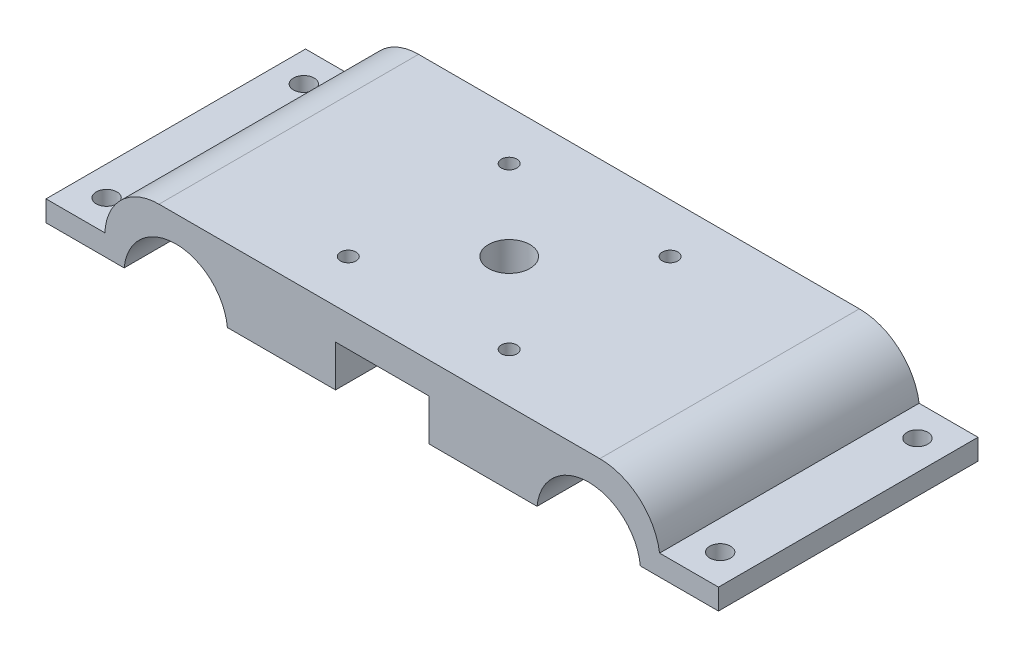
ISO-10303-21;
HEADER;
FILE_DESCRIPTION(('STEP AP214'),'2;1');
FILE_NAME('part.step','',(''),(''),'','','');
FILE_SCHEMA(('AUTOMOTIVE_DESIGN { 1 0 10303 214 1 1 1 1 }'));
ENDSEC;
DATA;
#1=APPLICATION_CONTEXT('core data for automotive mechanical design processes');
#2=APPLICATION_PROTOCOL_DEFINITION('international standard','automotive_design',2000,#1);
#3=PRODUCT_CONTEXT('',#1,'mechanical');
#4=PRODUCT('Part','Part','',(#3));
#5=PRODUCT_RELATED_PRODUCT_CATEGORY('part','',(#4));
#6=PRODUCT_DEFINITION_FORMATION('','',#4);
#7=PRODUCT_DEFINITION_CONTEXT('part definition',#1,'design');
#8=PRODUCT_DEFINITION('design','',#6,#7);
#9=PRODUCT_DEFINITION_SHAPE('','',#8);
#10=(LENGTH_UNIT() NAMED_UNIT(*) SI_UNIT(.MILLI.,.METRE.));
#11=(NAMED_UNIT(*) PLANE_ANGLE_UNIT() SI_UNIT($,.RADIAN.));
#12=(NAMED_UNIT(*) SI_UNIT($,.STERADIAN.) SOLID_ANGLE_UNIT());
#13=UNCERTAINTY_MEASURE_WITH_UNIT(LENGTH_MEASURE(1.E-05),#10,'distance_accuracy_value','');
#14=(GEOMETRIC_REPRESENTATION_CONTEXT(3) GLOBAL_UNCERTAINTY_ASSIGNED_CONTEXT((#13)) GLOBAL_UNIT_ASSIGNED_CONTEXT((#10,
#11,#12)) REPRESENTATION_CONTEXT('',''));
#15=CARTESIAN_POINT('',(0.,0.,0.));
#16=DIRECTION('',(0.,0.,1.));
#17=DIRECTION('',(1.,0.,0.));
#18=AXIS2_PLACEMENT_3D('',#15,#16,#17);
#19=CARTESIAN_POINT('',(-51.3618600632337,6.47404671071969,50.));
#20=DIRECTION('',(0.,0.,-1.));
#21=DIRECTION('',(-1.,0.,0.));
#22=AXIS2_PLACEMENT_3D('',#19,#20,#21);
#23=CYLINDRICAL_SURFACE('',#22,10.);
#24=CARTESIAN_POINT('',(-51.3618600632337,6.47404671071969,0.));
#25=DIRECTION('',(0.,0.,-1.));
#26=DIRECTION('',(-1.,0.,0.));
#27=AXIS2_PLACEMENT_3D('',#24,#25,#26);
#28=CIRCLE('',#27,10.);
#29=CARTESIAN_POINT('',(-61.3117344342999,7.47404671071969,0.));
#30=VERTEX_POINT('',#29);
#31=CARTESIAN_POINT('',(-41.4119856921675,7.47404671071969,0.));
#32=VERTEX_POINT('',#31);
#33=EDGE_CURVE('E171',#30,#32,#28,.T.);
#34=ORIENTED_EDGE('',*,*,#33,.T.);
#35=DIRECTION('',(0.,0.,-1.));
#36=VECTOR('',#35,1.);
#37=CARTESIAN_POINT('',(-41.4119856921675,7.47404671071969,50.));
#38=LINE('',#37,#36);
#39=CARTESIAN_POINT('',(-41.4119856921675,7.47404671071969,50.));
#40=VERTEX_POINT('',#39);
#41=EDGE_CURVE('E271',#32,#40,#38,.F.);
#42=ORIENTED_EDGE('',*,*,#41,.T.);
#43=CARTESIAN_POINT('',(-51.3618600632337,6.47404671071969,50.));
#44=DIRECTION('',(0.,0.,-1.));
#45=DIRECTION('',(-1.,0.,0.));
#46=AXIS2_PLACEMENT_3D('',#43,#44,#45);
#47=CIRCLE('',#46,10.);
#48=CARTESIAN_POINT('',(-61.3117344342999,7.47404671071969,50.));
#49=VERTEX_POINT('',#48);
#50=EDGE_CURVE('E185',#49,#40,#47,.T.);
#51=ORIENTED_EDGE('',*,*,#50,.F.);
#52=DIRECTION('',(0.,0.,-1.));
#53=VECTOR('',#52,1.);
#54=CARTESIAN_POINT('',(-61.3117344342999,7.47404671071969,50.));
#55=LINE('',#54,#53);
#56=EDGE_CURVE('E272',#49,#30,#55,.T.);
#57=ORIENTED_EDGE('',*,*,#56,.T.);
#58=EDGE_LOOP('',(#34,#42,#51,#57));
#59=FACE_BOUND('',#58,.T.);
#60=ADVANCED_FACE('F33',(#59),#23,.F.);
#61=CARTESIAN_POINT('',(28.1881399367662,6.47404671071969,50.));
#62=DIRECTION('',(0.,0.,-1.));
#63=DIRECTION('',(-1.,0.,0.));
#64=AXIS2_PLACEMENT_3D('',#61,#62,#63);
#65=CYLINDRICAL_SURFACE('',#64,10.);
#66=CARTESIAN_POINT('',(28.1881399367662,6.47404671071969,0.));
#67=DIRECTION('',(0.,0.,-1.));
#68=DIRECTION('',(-1.,0.,0.));
#69=AXIS2_PLACEMENT_3D('',#66,#67,#68);
#70=CIRCLE('',#69,10.);
#71=CARTESIAN_POINT('',(18.2382655657,7.47404671071969,0.));
#72=VERTEX_POINT('',#71);
#73=CARTESIAN_POINT('',(38.1380143078324,7.47404671071969,0.));
#74=VERTEX_POINT('',#73);
#75=EDGE_CURVE('E167',#72,#74,#70,.T.);
#76=ORIENTED_EDGE('',*,*,#75,.T.);
#77=DIRECTION('',(0.,0.,-1.));
#78=VECTOR('',#77,1.);
#79=CARTESIAN_POINT('',(38.1380143078324,7.47404671071969,50.));
#80=LINE('',#79,#78);
#81=CARTESIAN_POINT('',(38.1380143078324,7.47404671071969,50.));
#82=VERTEX_POINT('',#81);
#83=EDGE_CURVE('E49',#74,#82,#80,.F.);
#84=ORIENTED_EDGE('',*,*,#83,.T.);
#85=CARTESIAN_POINT('',(28.1881399367662,6.47404671071969,50.));
#86=DIRECTION('',(0.,0.,-1.));
#87=DIRECTION('',(-1.,0.,0.));
#88=AXIS2_PLACEMENT_3D('',#85,#86,#87);
#89=CIRCLE('',#88,10.);
#90=CARTESIAN_POINT('',(18.2382655657,7.47404671071969,50.));
#91=VERTEX_POINT('',#90);
#92=EDGE_CURVE('E250',#91,#82,#89,.T.);
#93=ORIENTED_EDGE('',*,*,#92,.F.);
#94=DIRECTION('',(0.,0.,-1.));
#95=VECTOR('',#94,1.);
#96=CARTESIAN_POINT('',(18.2382655657,7.47404671071969,50.));
#97=LINE('',#96,#95);
#98=EDGE_CURVE('E313',#91,#72,#97,.T.);
#99=ORIENTED_EDGE('',*,*,#98,.T.);
#100=EDGE_LOOP('',(#76,#84,#93,#99));
#101=FACE_BOUND('',#100,.T.);
#102=ADVANCED_FACE('F372',(#101),#65,.F.);
#103=CARTESIAN_POINT('',(53.1881399367662,6.47404671071969,50.));
#104=DIRECTION('',(-1.,0.,0.));
#105=DIRECTION('',(0.,-1.,0.));
#106=AXIS2_PLACEMENT_3D('',#103,#104,#105);
#107=PLANE('',#106);
#108=DIRECTION('',(0.,1.,0.));
#109=VECTOR('',#108,1.);
#110=CARTESIAN_POINT('',(53.1881399367662,6.47404671071969,50.));
#111=LINE('',#110,#109);
#112=CARTESIAN_POINT('',(53.1881399367662,7.47404671071969,50.));
#113=VERTEX_POINT('',#112);
#114=CARTESIAN_POINT('',(53.1881399367662,11.4740467107197,50.));
#115=VERTEX_POINT('',#114);
#116=EDGE_CURVE('E161',#113,#115,#111,.T.);
#117=ORIENTED_EDGE('',*,*,#116,.F.);
#118=DIRECTION('',(0.,0.,1.));
#119=VECTOR('',#118,1.);
#120=CARTESIAN_POINT('',(53.1881399367662,7.47404671071969,0.));
#121=LINE('',#120,#119);
#122=CARTESIAN_POINT('',(53.1881399367662,7.47404671071969,0.));
#123=VERTEX_POINT('',#122);
#124=EDGE_CURVE('E147',#123,#113,#121,.T.);
#125=ORIENTED_EDGE('',*,*,#124,.F.);
#126=DIRECTION('',(0.,1.,0.));
#127=VECTOR('',#126,1.);
#128=CARTESIAN_POINT('',(53.1881399367662,6.47404671071969,0.));
#129=LINE('',#128,#127);
#130=CARTESIAN_POINT('',(53.1881399367662,11.4740467107197,0.));
#131=VERTEX_POINT('',#130);
#132=EDGE_CURVE('E160',#123,#131,#129,.T.);
#133=ORIENTED_EDGE('',*,*,#132,.T.);
#134=DIRECTION('',(0.,0.,-1.));
#135=VECTOR('',#134,1.);
#136=CARTESIAN_POINT('',(53.1881399367662,11.4740467107197,50.));
#137=LINE('',#136,#135);
#138=EDGE_CURVE('E11',#115,#131,#137,.T.);
#139=ORIENTED_EDGE('',*,*,#138,.F.);
#140=EDGE_LOOP('',(#117,#125,#133,#139));
#141=FACE_BOUND('',#140,.T.);
#142=ADVANCED_FACE('F158',(#141),#107,.F.);
#143=CARTESIAN_POINT('',(53.1881399367662,11.4740467107197,50.));
#144=DIRECTION('',(0.,-1.,0.));
#145=DIRECTION('',(1.,0.,0.));
#146=AXIS2_PLACEMENT_3D('',#143,#144,#145);
#147=PLANE('',#146);
#148=CARTESIAN_POINT('',(47.5181399367662,11.4740467107197,44.));
#149=DIRECTION('',(0.,1.,0.));
#150=DIRECTION('',(-1.,0.,0.));
#151=AXIS2_PLACEMENT_3D('',#148,#149,#150);
#152=CIRCLE('',#151,2.);
#153=CARTESIAN_POINT('',(45.5181399367662,11.4740467107197,44.));
#154=VERTEX_POINT('',#153);
#155=EDGE_CURVE('E234',#154,#154,#152,.T.);
#156=ORIENTED_EDGE('',*,*,#155,.F.);
#157=EDGE_LOOP('',(#156));
#158=FACE_BOUND('',#157,.T.);
#159=CARTESIAN_POINT('',(47.5181399367662,11.4740467107197,6.));
#160=DIRECTION('',(0.,1.,0.));
#161=DIRECTION('',(-1.,0.,0.));
#162=AXIS2_PLACEMENT_3D('',#159,#160,#161);
#163=CIRCLE('',#162,2.);
#164=CARTESIAN_POINT('',(45.5181399367662,11.4740467107197,6.));
#165=VERTEX_POINT('',#164);
#166=EDGE_CURVE('E239',#165,#165,#163,.T.);
#167=ORIENTED_EDGE('',*,*,#166,.F.);
#168=EDGE_LOOP('',(#167));
#169=FACE_BOUND('',#168,.T.);
#170=DIRECTION('',(-1.,0.,0.));
#171=VECTOR('',#170,1.);
#172=CARTESIAN_POINT('',(53.1881399367662,11.4740467107197,0.));
#173=LINE('',#172,#171);
#174=CARTESIAN_POINT('',(41.8483939746106,11.4740467107197,0.));
#175=VERTEX_POINT('',#174);
#176=EDGE_CURVE('E166',#131,#175,#173,.T.);
#177=ORIENTED_EDGE('',*,*,#176,.T.);
#178=DIRECTION('',(0.,0.,-1.));
#179=VECTOR('',#178,1.);
#180=CARTESIAN_POINT('',(41.8483939746106,11.4740467107197,50.));
#181=LINE('',#180,#179);
#182=CARTESIAN_POINT('',(41.8483939746106,11.4740467107197,50.));
#183=VERTEX_POINT('',#182);
#184=EDGE_CURVE('E41',#183,#175,#181,.T.);
#185=ORIENTED_EDGE('',*,*,#184,.F.);
#186=DIRECTION('',(-1.,0.,0.));
#187=VECTOR('',#186,1.);
#188=CARTESIAN_POINT('',(53.1881399367662,11.4740467107197,50.));
#189=LINE('',#188,#187);
#190=EDGE_CURVE('E254',#115,#183,#189,.T.);
#191=ORIENTED_EDGE('',*,*,#190,.F.);
#192=ORIENTED_EDGE('',*,*,#138,.T.);
#193=EDGE_LOOP('',(#177,#185,#191,#192));
#194=FACE_BOUND('',#193,.T.);
#195=ADVANCED_FACE('F362',(#158,#169,#194),#147,.F.);
#196=CARTESIAN_POINT('',(30.3300740869905,9.84046205904238,50.));
#197=DIRECTION('',(0.,0.,-1.));
#198=DIRECTION('',(-1.,0.,0.));
#199=AXIS2_PLACEMENT_3D('',#196,#197,#198);
#200=CYLINDRICAL_SURFACE('',#199,11.6335846516773);
#201=CARTESIAN_POINT('',(30.3300740869905,9.84046205904238,0.));
#202=DIRECTION('',(0.,0.,1.));
#203=DIRECTION('',(1.,0.,0.));
#204=AXIS2_PLACEMENT_3D('',#201,#202,#203);
#205=CIRCLE('',#204,11.6335846516773);
#206=CARTESIAN_POINT('',(30.3300740869905,21.4740467107197,0.));
#207=VERTEX_POINT('',#206);
#208=EDGE_CURVE('E169',#175,#207,#205,.T.);
#209=ORIENTED_EDGE('',*,*,#208,.T.);
#210=DIRECTION('',(0.,0.,-1.));
#211=VECTOR('',#210,1.);
#212=CARTESIAN_POINT('',(30.3300740869905,21.4740467107197,50.));
#213=LINE('',#212,#211);
#214=CARTESIAN_POINT('',(30.3300740869905,21.4740467107197,50.));
#215=VERTEX_POINT('',#214);
#216=EDGE_CURVE('E196',#215,#207,#213,.T.);
#217=ORIENTED_EDGE('',*,*,#216,.F.);
#218=CARTESIAN_POINT('',(30.3300740869905,9.84046205904238,50.));
#219=DIRECTION('',(0.,0.,1.));
#220=DIRECTION('',(1.,0.,0.));
#221=AXIS2_PLACEMENT_3D('',#218,#219,#220);
#222=CIRCLE('',#221,11.6335846516773);
#223=EDGE_CURVE('E256',#183,#215,#222,.T.);
#224=ORIENTED_EDGE('',*,*,#223,.F.);
#225=ORIENTED_EDGE('',*,*,#184,.T.);
#226=EDGE_LOOP('',(#209,#217,#224,#225));
#227=FACE_BOUND('',#226,.T.);
#228=ADVANCED_FACE('F332',(#227),#200,.T.);
#229=CARTESIAN_POINT('',(-54.5909663303495,21.4740467107197,50.));
#230=DIRECTION('',(0.,-1.,0.));
#231=DIRECTION('',(1.,0.,0.));
#232=AXIS2_PLACEMENT_3D('',#229,#230,#231);
#233=PLANE('',#232);
#234=CARTESIAN_POINT('',(-27.6304461216795,21.4740467107197,40.5));
#235=DIRECTION('',(0.,1.,0.));
#236=DIRECTION('',(-1.,0.,0.));
#237=AXIS2_PLACEMENT_3D('',#234,#235,#236);
#238=CIRCLE('',#237,1.5);
#239=CARTESIAN_POINT('',(-29.1304461216795,21.4740467107197,40.5));
#240=VERTEX_POINT('',#239);
#241=EDGE_CURVE('E318',#240,#240,#238,.T.);
#242=ORIENTED_EDGE('',*,*,#241,.F.);
#243=EDGE_LOOP('',(#242));
#244=FACE_BOUND('',#243,.T.);
#245=CARTESIAN_POINT('',(3.36955387832047,21.4740467107197,40.5));
#246=DIRECTION('',(0.,1.,0.));
#247=DIRECTION('',(-1.,0.,0.));
#248=AXIS2_PLACEMENT_3D('',#245,#246,#247);
#249=CIRCLE('',#248,1.5);
#250=CARTESIAN_POINT('',(1.86955387832047,21.4740467107197,40.5));
#251=VERTEX_POINT('',#250);
#252=EDGE_CURVE('E321',#251,#251,#249,.T.);
#253=ORIENTED_EDGE('',*,*,#252,.F.);
#254=EDGE_LOOP('',(#253));
#255=FACE_BOUND('',#254,.T.);
#256=CARTESIAN_POINT('',(3.36955387832047,21.4740467107197,9.5));
#257=DIRECTION('',(0.,1.,0.));
#258=DIRECTION('',(-1.,0.,0.));
#259=AXIS2_PLACEMENT_3D('',#256,#257,#258);
#260=CIRCLE('',#259,1.5);
#261=CARTESIAN_POINT('',(1.86955387832047,21.4740467107197,9.5));
#262=VERTEX_POINT('',#261);
#263=EDGE_CURVE('E215',#262,#262,#260,.T.);
#264=ORIENTED_EDGE('',*,*,#263,.F.);
#265=EDGE_LOOP('',(#264));
#266=FACE_BOUND('',#265,.T.);
#267=CARTESIAN_POINT('',(-27.6304461216795,21.4740467107197,9.5));
#268=DIRECTION('',(0.,1.,0.));
#269=DIRECTION('',(-1.,0.,0.));
#270=AXIS2_PLACEMENT_3D('',#267,#268,#269);
#271=CIRCLE('',#270,1.5);
#272=CARTESIAN_POINT('',(-29.1304461216795,21.4740467107197,9.5));
#273=VERTEX_POINT('',#272);
#274=EDGE_CURVE('E210',#273,#273,#271,.T.);
#275=ORIENTED_EDGE('',*,*,#274,.F.);
#276=EDGE_LOOP('',(#275));
#277=FACE_BOUND('',#276,.T.);
#278=CARTESIAN_POINT('',(-12.1304461216795,21.4740467107197,25.));
#279=DIRECTION('',(0.,1.,0.));
#280=DIRECTION('',(-1.,0.,0.));
#281=AXIS2_PLACEMENT_3D('',#278,#279,#280);
#282=CIRCLE('',#281,4.);
#283=CARTESIAN_POINT('',(-16.1304461216795,21.4740467107197,25.));
#284=VERTEX_POINT('',#283);
#285=EDGE_CURVE('E203',#284,#284,#282,.T.);
#286=ORIENTED_EDGE('',*,*,#285,.F.);
#287=EDGE_LOOP('',(#286));
#288=FACE_BOUND('',#287,.T.);
#289=DIRECTION('',(-1.,0.,0.));
#290=VECTOR('',#289,1.);
#291=CARTESIAN_POINT('',(-54.5909663303495,21.4740467107197,0.));
#292=LINE('',#291,#290);
#293=CARTESIAN_POINT('',(-54.5909663303495,21.4740467107197,0.));
#294=VERTEX_POINT('',#293);
#295=EDGE_CURVE('E176',#207,#294,#292,.T.);
#296=ORIENTED_EDGE('',*,*,#295,.T.);
#297=DIRECTION('',(0.,0.,-1.));
#298=VECTOR('',#297,1.);
#299=CARTESIAN_POINT('',(-54.5909663303495,21.4740467107197,50.));
#300=LINE('',#299,#298);
#301=CARTESIAN_POINT('',(-54.5909663303495,21.4740467107197,50.));
#302=VERTEX_POINT('',#301);
#303=EDGE_CURVE('E193',#302,#294,#300,.T.);
#304=ORIENTED_EDGE('',*,*,#303,.F.);
#305=DIRECTION('',(-1.,0.,0.));
#306=VECTOR('',#305,1.);
#307=CARTESIAN_POINT('',(-54.5909663303495,21.4740467107197,50.));
#308=LINE('',#307,#306);
#309=EDGE_CURVE('E258',#215,#302,#308,.T.);
#310=ORIENTED_EDGE('',*,*,#309,.F.);
#311=ORIENTED_EDGE('',*,*,#216,.T.);
#312=EDGE_LOOP('',(#296,#304,#310,#311));
#313=FACE_BOUND('',#312,.T.);
#314=ADVANCED_FACE('F328',(#244,#255,#266,#277,#288,#313),#233,.F.);
#315=CARTESIAN_POINT('',(-54.5909663303495,11.0336045199808,50.));
#316=DIRECTION('',(0.,0.,-1.));
#317=DIRECTION('',(-1.,0.,0.));
#318=AXIS2_PLACEMENT_3D('',#315,#316,#317);
#319=CYLINDRICAL_SURFACE('',#318,10.4404421907388);
#320=CARTESIAN_POINT('',(-54.5909663303495,11.0336045199808,0.));
#321=DIRECTION('',(0.,0.,1.));
#322=DIRECTION('',(-1.,0.,0.));
#323=AXIS2_PLACEMENT_3D('',#320,#321,#322);
#324=CIRCLE('',#323,10.4404421907388);
#325=CARTESIAN_POINT('',(-65.0221141010781,11.4740467107197,0.));
#326=VERTEX_POINT('',#325);
#327=EDGE_CURVE('E178',#294,#326,#324,.T.);
#328=ORIENTED_EDGE('',*,*,#327,.T.);
#329=DIRECTION('',(0.,0.,-1.));
#330=VECTOR('',#329,1.);
#331=CARTESIAN_POINT('',(-65.0221141010781,11.4740467107197,50.));
#332=LINE('',#331,#330);
#333=CARTESIAN_POINT('',(-65.0221141010781,11.4740467107197,50.));
#334=VERTEX_POINT('',#333);
#335=EDGE_CURVE('E189',#334,#326,#332,.T.);
#336=ORIENTED_EDGE('',*,*,#335,.F.);
#337=CARTESIAN_POINT('',(-54.5909663303495,11.0336045199808,50.));
#338=DIRECTION('',(0.,0.,1.));
#339=DIRECTION('',(-1.,0.,0.));
#340=AXIS2_PLACEMENT_3D('',#337,#338,#339);
#341=CIRCLE('',#340,10.4404421907388);
#342=EDGE_CURVE('E260',#302,#334,#341,.T.);
#343=ORIENTED_EDGE('',*,*,#342,.F.);
#344=ORIENTED_EDGE('',*,*,#303,.T.);
#345=EDGE_LOOP('',(#328,#336,#343,#344));
#346=FACE_BOUND('',#345,.T.);
#347=ADVANCED_FACE('F331',(#346),#319,.T.);
#348=CARTESIAN_POINT('',(-65.0221141010781,11.4740467107197,50.));
#349=DIRECTION('',(0.,-1.,0.));
#350=DIRECTION('',(1.,0.,0.));
#351=AXIS2_PLACEMENT_3D('',#348,#349,#350);
#352=PLANE('',#351);
#353=CARTESIAN_POINT('',(-70.6918600632337,11.4740467107196,44.));
#354=DIRECTION('',(0.,1.,0.));
#355=DIRECTION('',(-1.,0.,0.));
#356=AXIS2_PLACEMENT_3D('',#353,#354,#355);
#357=CIRCLE('',#356,2.);
#358=CARTESIAN_POINT('',(-72.6918600632337,11.4740467107196,44.));
#359=VERTEX_POINT('',#358);
#360=EDGE_CURVE('E242',#359,#359,#357,.T.);
#361=ORIENTED_EDGE('',*,*,#360,.F.);
#362=EDGE_LOOP('',(#361));
#363=FACE_BOUND('',#362,.T.);
#364=CARTESIAN_POINT('',(-70.6918600632337,11.4740467107196,6.));
#365=DIRECTION('',(0.,1.,0.));
#366=DIRECTION('',(-1.,0.,0.));
#367=AXIS2_PLACEMENT_3D('',#364,#365,#366);
#368=CIRCLE('',#367,2.);
#369=CARTESIAN_POINT('',(-72.6918600632337,11.4740467107196,6.));
#370=VERTEX_POINT('',#369);
#371=EDGE_CURVE('E245',#370,#370,#368,.T.);
#372=ORIENTED_EDGE('',*,*,#371,.F.);
#373=EDGE_LOOP('',(#372));
#374=FACE_BOUND('',#373,.T.);
#375=DIRECTION('',(-1.,0.,0.));
#376=VECTOR('',#375,1.);
#377=CARTESIAN_POINT('',(-65.0221141010781,11.4740467107197,0.));
#378=LINE('',#377,#376);
#379=CARTESIAN_POINT('',(-76.3618600632337,11.4740467107197,0.));
#380=VERTEX_POINT('',#379);
#381=EDGE_CURVE('E180',#326,#380,#378,.T.);
#382=ORIENTED_EDGE('',*,*,#381,.T.);
#383=DIRECTION('',(0.,0.,-1.));
#384=VECTOR('',#383,1.);
#385=CARTESIAN_POINT('',(-76.3618600632337,11.4740467107197,50.));
#386=LINE('',#385,#384);
#387=CARTESIAN_POINT('',(-76.3618600632337,11.4740467107197,50.));
#388=VERTEX_POINT('',#387);
#389=EDGE_CURVE('E186',#388,#380,#386,.T.);
#390=ORIENTED_EDGE('',*,*,#389,.F.);
#391=DIRECTION('',(-1.,0.,0.));
#392=VECTOR('',#391,1.);
#393=CARTESIAN_POINT('',(-65.0221141010781,11.4740467107197,50.));
#394=LINE('',#393,#392);
#395=EDGE_CURVE('E262',#334,#388,#394,.T.);
#396=ORIENTED_EDGE('',*,*,#395,.F.);
#397=ORIENTED_EDGE('',*,*,#335,.T.);
#398=EDGE_LOOP('',(#382,#390,#396,#397));
#399=FACE_BOUND('',#398,.T.);
#400=ADVANCED_FACE('F349',(#363,#374,#399),#352,.F.);
#401=CARTESIAN_POINT('',(-76.3618600632337,6.47404671071969,50.));
#402=DIRECTION('',(1.,0.,0.));
#403=DIRECTION('',(0.,1.,0.));
#404=AXIS2_PLACEMENT_3D('',#401,#402,#403);
#405=PLANE('',#404);
#406=DIRECTION('',(0.,-1.,0.));
#407=VECTOR('',#406,1.);
#408=CARTESIAN_POINT('',(-76.3618600632337,6.47404671071969,0.));
#409=LINE('',#408,#407);
#410=CARTESIAN_POINT('',(-76.3618600632337,7.47404671071969,0.));
#411=VERTEX_POINT('',#410);
#412=EDGE_CURVE('E182',#380,#411,#409,.T.);
#413=ORIENTED_EDGE('',*,*,#412,.T.);
#414=DIRECTION('',(0.,0.,1.));
#415=VECTOR('',#414,1.);
#416=CARTESIAN_POINT('',(-76.3618600632337,7.47404671071969,0.));
#417=LINE('',#416,#415);
#418=CARTESIAN_POINT('',(-76.3618600632337,7.47404671071969,50.));
#419=VERTEX_POINT('',#418);
#420=EDGE_CURVE('E57',#411,#419,#417,.T.);
#421=ORIENTED_EDGE('',*,*,#420,.T.);
#422=DIRECTION('',(0.,-1.,0.));
#423=VECTOR('',#422,1.);
#424=CARTESIAN_POINT('',(-76.3618600632337,6.47404671071969,50.));
#425=LINE('',#424,#423);
#426=EDGE_CURVE('E190',#388,#419,#425,.T.);
#427=ORIENTED_EDGE('',*,*,#426,.F.);
#428=ORIENTED_EDGE('',*,*,#389,.T.);
#429=EDGE_LOOP('',(#413,#421,#427,#428));
#430=FACE_BOUND('',#429,.T.);
#431=ADVANCED_FACE('F353',(#430),#405,.F.);
#432=CARTESIAN_POINT('',(-51.3618600632337,6.47404671071969,50.));
#433=DIRECTION('',(0.,0.,-1.));
#434=DIRECTION('',(-1.,0.,0.));
#435=AXIS2_PLACEMENT_3D('',#432,#433,#434);
#436=PLANE('',#435);
#437=ORIENTED_EDGE('',*,*,#426,.T.);
#438=DIRECTION('',(-1.,0.,0.));
#439=VECTOR('',#438,1.);
#440=CARTESIAN_POINT('',(-76.3618600632337,7.47404671071969,50.));
#441=LINE('',#440,#439);
#442=EDGE_CURVE('E281',#49,#419,#441,.T.);
#443=ORIENTED_EDGE('',*,*,#442,.F.);
#444=ORIENTED_EDGE('',*,*,#50,.T.);
#445=CARTESIAN_POINT('',(-20.5868600632338,7.47404671071969,50.));
#446=VERTEX_POINT('',#445);
#447=EDGE_CURVE('E389',#446,#40,#441,.T.);
#448=ORIENTED_EDGE('',*,*,#447,.F.);
#449=DIRECTION('',(0.,-1.,0.));
#450=VECTOR('',#449,1.);
#451=CARTESIAN_POINT('',(-20.5868600632337,6.47404671071969,50.));
#452=LINE('',#451,#450);
#453=CARTESIAN_POINT('',(-20.5868600632337,15.4740467107197,50.));
#454=VERTEX_POINT('',#453);
#455=EDGE_CURVE('E202',#454,#446,#452,.T.);
#456=ORIENTED_EDGE('',*,*,#455,.F.);
#457=DIRECTION('',(-1.,0.,0.));
#458=VECTOR('',#457,1.);
#459=CARTESIAN_POINT('',(-20.5868600632337,15.4740467107197,50.));
#460=LINE('',#459,#458);
#461=CARTESIAN_POINT('',(-2.58686006323375,15.4740467107197,50.));
#462=VERTEX_POINT('',#461);
#463=EDGE_CURVE('E223',#462,#454,#460,.T.);
#464=ORIENTED_EDGE('',*,*,#463,.F.);
#465=DIRECTION('',(0.,1.,0.));
#466=VECTOR('',#465,1.);
#467=CARTESIAN_POINT('',(-2.58686006323375,6.47404671071969,50.));
#468=LINE('',#467,#466);
#469=CARTESIAN_POINT('',(-2.58686006323375,7.47404671071969,50.));
#470=VERTEX_POINT('',#469);
#471=EDGE_CURVE('E207',#470,#462,#468,.T.);
#472=ORIENTED_EDGE('',*,*,#471,.F.);
#473=EDGE_CURVE('E280',#91,#470,#441,.T.);
#474=ORIENTED_EDGE('',*,*,#473,.F.);
#475=ORIENTED_EDGE('',*,*,#92,.T.);
#476=EDGE_CURVE('E277',#113,#82,#441,.T.);
#477=ORIENTED_EDGE('',*,*,#476,.F.);
#478=ORIENTED_EDGE('',*,*,#116,.T.);
#479=ORIENTED_EDGE('',*,*,#190,.T.);
#480=ORIENTED_EDGE('',*,*,#223,.T.);
#481=ORIENTED_EDGE('',*,*,#309,.T.);
#482=ORIENTED_EDGE('',*,*,#342,.T.);
#483=ORIENTED_EDGE('',*,*,#395,.T.);
#484=EDGE_LOOP('',(#437,#443,#444,#448,#456,#464,#472,#474,#475,#477,#478,#479,#480,#481,#482,#483));
#485=FACE_BOUND('',#484,.T.);
#486=ADVANCED_FACE('F356',(#485),#436,.F.);
#487=CARTESIAN_POINT('',(-51.3618600632337,6.47404671071969,0.));
#488=DIRECTION('',(0.,0.,-1.));
#489=DIRECTION('',(-1.,0.,0.));
#490=AXIS2_PLACEMENT_3D('',#487,#488,#489);
#491=PLANE('',#490);
#492=DIRECTION('',(-1.,0.,0.));
#493=VECTOR('',#492,1.);
#494=CARTESIAN_POINT('',(-76.3618600632337,7.47404671071969,0.));
#495=LINE('',#494,#493);
#496=EDGE_CURVE('E155',#30,#411,#495,.T.);
#497=ORIENTED_EDGE('',*,*,#496,.T.);
#498=ORIENTED_EDGE('',*,*,#412,.F.);
#499=ORIENTED_EDGE('',*,*,#381,.F.);
#500=ORIENTED_EDGE('',*,*,#327,.F.);
#501=ORIENTED_EDGE('',*,*,#295,.F.);
#502=ORIENTED_EDGE('',*,*,#208,.F.);
#503=ORIENTED_EDGE('',*,*,#176,.F.);
#504=ORIENTED_EDGE('',*,*,#132,.F.);
#505=EDGE_CURVE('E144',#123,#74,#495,.T.);
#506=ORIENTED_EDGE('',*,*,#505,.T.);
#507=ORIENTED_EDGE('',*,*,#75,.F.);
#508=EDGE_CURVE('E153',#72,#32,#495,.T.);
#509=ORIENTED_EDGE('',*,*,#508,.T.);
#510=ORIENTED_EDGE('',*,*,#33,.F.);
#511=EDGE_LOOP('',(#497,#498,#499,#500,#501,#502,#503,#504,#506,#507,#509,#510));
#512=FACE_BOUND('',#511,.T.);
#513=ADVANCED_FACE('F164',(#512),#491,.T.);
#514=CARTESIAN_POINT('',(-70.6918600632337,6.47404671071961,6.));
#515=DIRECTION('',(0.,1.,0.));
#516=DIRECTION('',(-1.,0.,0.));
#517=AXIS2_PLACEMENT_3D('',#514,#515,#516);
#518=CYLINDRICAL_SURFACE('',#517,2.);
#519=CARTESIAN_POINT('',(-70.6918600632337,7.47404671071969,6.));
#520=DIRECTION('',(0.,1.,0.));
#521=DIRECTION('',(0.,0.,1.));
#522=AXIS2_PLACEMENT_3D('',#519,#520,#521);
#523=CIRCLE('',#522,2.);
#524=CARTESIAN_POINT('',(-70.6918600632337,7.47404671071969,8.));
#525=VERTEX_POINT('',#524);
#526=EDGE_CURVE('E310',#525,#525,#523,.F.);
#527=ORIENTED_EDGE('',*,*,#526,.T.);
#528=EDGE_LOOP('',(#527));
#529=FACE_BOUND('',#528,.T.);
#530=ORIENTED_EDGE('',*,*,#371,.T.);
#531=EDGE_LOOP('',(#530));
#532=FACE_BOUND('',#531,.T.);
#533=ADVANCED_FACE('F461',(#529,#532),#518,.F.);
#534=CARTESIAN_POINT('',(-70.6918600632337,6.47404671071961,44.));
#535=DIRECTION('',(0.,1.,0.));
#536=DIRECTION('',(-1.,0.,0.));
#537=AXIS2_PLACEMENT_3D('',#534,#535,#536);
#538=CYLINDRICAL_SURFACE('',#537,2.);
#539=CARTESIAN_POINT('',(-70.6918600632337,7.47404671071969,44.));
#540=DIRECTION('',(0.,1.,0.));
#541=DIRECTION('',(0.,0.,1.));
#542=AXIS2_PLACEMENT_3D('',#539,#540,#541);
#543=CIRCLE('',#542,2.);
#544=CARTESIAN_POINT('',(-70.6918600632337,7.47404671071969,46.));
#545=VERTEX_POINT('',#544);
#546=EDGE_CURVE('E307',#545,#545,#543,.F.);
#547=ORIENTED_EDGE('',*,*,#546,.T.);
#548=EDGE_LOOP('',(#547));
#549=FACE_BOUND('',#548,.T.);
#550=ORIENTED_EDGE('',*,*,#360,.T.);
#551=EDGE_LOOP('',(#550));
#552=FACE_BOUND('',#551,.T.);
#553=ADVANCED_FACE('F457',(#549,#552),#538,.F.);
#554=CARTESIAN_POINT('',(47.5181399367662,6.47404671071969,6.));
#555=DIRECTION('',(0.,1.,0.));
#556=DIRECTION('',(-1.,0.,0.));
#557=AXIS2_PLACEMENT_3D('',#554,#555,#556);
#558=CYLINDRICAL_SURFACE('',#557,2.);
#559=CARTESIAN_POINT('',(47.5181399367662,7.47404671071969,6.));
#560=DIRECTION('',(0.,1.,0.));
#561=DIRECTION('',(0.,0.,1.));
#562=AXIS2_PLACEMENT_3D('',#559,#560,#561);
#563=CIRCLE('',#562,2.);
#564=CARTESIAN_POINT('',(47.5181399367662,7.47404671071969,8.));
#565=VERTEX_POINT('',#564);
#566=EDGE_CURVE('E304',#565,#565,#563,.F.);
#567=ORIENTED_EDGE('',*,*,#566,.T.);
#568=EDGE_LOOP('',(#567));
#569=FACE_BOUND('',#568,.T.);
#570=ORIENTED_EDGE('',*,*,#166,.T.);
#571=EDGE_LOOP('',(#570));
#572=FACE_BOUND('',#571,.T.);
#573=ADVANCED_FACE('F453',(#569,#572),#558,.F.);
#574=CARTESIAN_POINT('',(47.5181399367662,6.47404671071969,44.));
#575=DIRECTION('',(0.,1.,0.));
#576=DIRECTION('',(-1.,0.,0.));
#577=AXIS2_PLACEMENT_3D('',#574,#575,#576);
#578=CYLINDRICAL_SURFACE('',#577,2.);
#579=CARTESIAN_POINT('',(47.5181399367662,7.47404671071969,44.));
#580=DIRECTION('',(0.,1.,0.));
#581=DIRECTION('',(0.,0.,1.));
#582=AXIS2_PLACEMENT_3D('',#579,#580,#581);
#583=CIRCLE('',#582,2.);
#584=CARTESIAN_POINT('',(47.5181399367662,7.47404671071969,46.));
#585=VERTEX_POINT('',#584);
#586=EDGE_CURVE('E301',#585,#585,#583,.F.);
#587=ORIENTED_EDGE('',*,*,#586,.T.);
#588=EDGE_LOOP('',(#587));
#589=FACE_BOUND('',#588,.T.);
#590=ORIENTED_EDGE('',*,*,#155,.T.);
#591=EDGE_LOOP('',(#590));
#592=FACE_BOUND('',#591,.T.);
#593=ADVANCED_FACE('F449',(#589,#592),#578,.F.);
#594=CARTESIAN_POINT('',(-20.5868600632337,6.47404671071969,15.));
#595=DIRECTION('',(-1.,0.,0.));
#596=DIRECTION('',(0.,0.,1.));
#597=AXIS2_PLACEMENT_3D('',#594,#595,#596);
#598=PLANE('',#597);
#599=ORIENTED_EDGE('',*,*,#455,.T.);
#600=DIRECTION('',(0.,0.,-1.));
#601=VECTOR('',#600,1.);
#602=CARTESIAN_POINT('',(-20.5868600632337,7.47404671071969,15.));
#603=LINE('',#602,#601);
#604=CARTESIAN_POINT('',(-20.5868600632337,7.47404671071969,15.));
#605=VERTEX_POINT('',#604);
#606=EDGE_CURVE('E298',#446,#605,#603,.T.);
#607=ORIENTED_EDGE('',*,*,#606,.T.);
#608=DIRECTION('',(0.,-1.,0.));
#609=VECTOR('',#608,1.);
#610=CARTESIAN_POINT('',(-20.5868600632337,6.47404671071969,15.));
#611=LINE('',#610,#609);
#612=CARTESIAN_POINT('',(-20.5868600632337,15.4740467107197,15.));
#613=VERTEX_POINT('',#612);
#614=EDGE_CURVE('E219',#613,#605,#611,.T.);
#615=ORIENTED_EDGE('',*,*,#614,.F.);
#616=DIRECTION('',(0.,0.,1.));
#617=VECTOR('',#616,1.);
#618=CARTESIAN_POINT('',(-20.5868600632337,15.4740467107197,15.));
#619=LINE('',#618,#617);
#620=EDGE_CURVE('E232',#613,#454,#619,.T.);
#621=ORIENTED_EDGE('',*,*,#620,.T.);
#622=EDGE_LOOP('',(#599,#607,#615,#621));
#623=FACE_BOUND('',#622,.T.);
#624=ADVANCED_FACE('F443',(#623),#598,.F.);
#625=CARTESIAN_POINT('',(-20.5868600632337,15.4740467107197,15.));
#626=DIRECTION('',(0.,1.,0.));
#627=DIRECTION('',(0.,0.,1.));
#628=AXIS2_PLACEMENT_3D('',#625,#626,#627);
#629=PLANE('',#628);
#630=CARTESIAN_POINT('',(-12.1304461216795,15.4740467107197,25.));
#631=DIRECTION('',(0.,1.,0.));
#632=DIRECTION('',(0.,0.,1.));
#633=AXIS2_PLACEMENT_3D('',#630,#631,#632);
#634=CIRCLE('',#633,4.);
#635=CARTESIAN_POINT('',(-12.1304461216795,15.4740467107197,29.));
#636=VERTEX_POINT('',#635);
#637=EDGE_CURVE('E200',#636,#636,#634,.T.);
#638=ORIENTED_EDGE('',*,*,#637,.T.);
#639=EDGE_LOOP('',(#638));
#640=FACE_BOUND('',#639,.T.);
#641=ORIENTED_EDGE('',*,*,#463,.T.);
#642=ORIENTED_EDGE('',*,*,#620,.F.);
#643=DIRECTION('',(-1.,0.,0.));
#644=VECTOR('',#643,1.);
#645=CARTESIAN_POINT('',(-20.5868600632337,15.4740467107197,15.));
#646=LINE('',#645,#644);
#647=CARTESIAN_POINT('',(-2.58686006323375,15.4740467107197,15.));
#648=VERTEX_POINT('',#647);
#649=EDGE_CURVE('E225',#648,#613,#646,.T.);
#650=ORIENTED_EDGE('',*,*,#649,.F.);
#651=DIRECTION('',(0.,0.,1.));
#652=VECTOR('',#651,1.);
#653=CARTESIAN_POINT('',(-2.58686006323375,15.4740467107197,15.));
#654=LINE('',#653,#652);
#655=EDGE_CURVE('E227',#648,#462,#654,.T.);
#656=ORIENTED_EDGE('',*,*,#655,.T.);
#657=EDGE_LOOP('',(#641,#642,#650,#656));
#658=FACE_BOUND('',#657,.T.);
#659=ADVANCED_FACE('F440',(#640,#658),#629,.F.);
#660=CARTESIAN_POINT('',(-2.58686006323375,6.47404671071969,15.));
#661=DIRECTION('',(1.,0.,0.));
#662=DIRECTION('',(0.,0.,-1.));
#663=AXIS2_PLACEMENT_3D('',#660,#661,#662);
#664=PLANE('',#663);
#665=DIRECTION('',(0.,1.,0.));
#666=VECTOR('',#665,1.);
#667=CARTESIAN_POINT('',(-2.58686006323375,6.47404671071969,15.));
#668=LINE('',#667,#666);
#669=CARTESIAN_POINT('',(-2.58686006323375,7.47404671071969,15.));
#670=VERTEX_POINT('',#669);
#671=EDGE_CURVE('E222',#670,#648,#668,.T.);
#672=ORIENTED_EDGE('',*,*,#671,.F.);
#673=DIRECTION('',(0.,0.,1.));
#674=VECTOR('',#673,1.);
#675=CARTESIAN_POINT('',(-2.58686006323375,7.47404671071969,15.));
#676=LINE('',#675,#674);
#677=EDGE_CURVE('E295',#670,#470,#676,.T.);
#678=ORIENTED_EDGE('',*,*,#677,.T.);
#679=ORIENTED_EDGE('',*,*,#471,.T.);
#680=ORIENTED_EDGE('',*,*,#655,.F.);
#681=EDGE_LOOP('',(#672,#678,#679,#680));
#682=FACE_BOUND('',#681,.T.);
#683=ADVANCED_FACE('F438',(#682),#664,.F.);
#684=CARTESIAN_POINT('',(0.,0.,15.));
#685=DIRECTION('',(0.,0.,-1.));
#686=DIRECTION('',(-1.,0.,0.));
#687=AXIS2_PLACEMENT_3D('',#684,#685,#686);
#688=PLANE('',#687);
#689=ORIENTED_EDGE('',*,*,#614,.T.);
#690=DIRECTION('',(1.,0.,0.));
#691=VECTOR('',#690,1.);
#692=CARTESIAN_POINT('',(0.,7.47404671071969,15.));
#693=LINE('',#692,#691);
#694=EDGE_CURVE('E292',#605,#670,#693,.T.);
#695=ORIENTED_EDGE('',*,*,#694,.T.);
#696=ORIENTED_EDGE('',*,*,#671,.T.);
#697=ORIENTED_EDGE('',*,*,#649,.T.);
#698=EDGE_LOOP('',(#689,#695,#696,#697));
#699=FACE_BOUND('',#698,.T.);
#700=ADVANCED_FACE('F435',(#699),#688,.F.);
#701=CARTESIAN_POINT('',(-12.1304461216795,6.47404671071961,25.));
#702=DIRECTION('',(0.,1.,0.));
#703=DIRECTION('',(-1.,0.,0.));
#704=AXIS2_PLACEMENT_3D('',#701,#702,#703);
#705=CYLINDRICAL_SURFACE('',#704,4.);
#706=ORIENTED_EDGE('',*,*,#285,.T.);
#707=EDGE_LOOP('',(#706));
#708=FACE_BOUND('',#707,.T.);
#709=ORIENTED_EDGE('',*,*,#637,.F.);
#710=EDGE_LOOP('',(#709));
#711=FACE_BOUND('',#710,.T.);
#712=ADVANCED_FACE('F429',(#708,#711),#705,.F.);
#713=CARTESIAN_POINT('',(-27.6304461216795,6.47404671071961,9.5));
#714=DIRECTION('',(0.,1.,0.));
#715=DIRECTION('',(-1.,0.,0.));
#716=AXIS2_PLACEMENT_3D('',#713,#714,#715);
#717=CYLINDRICAL_SURFACE('',#716,1.5);
#718=CARTESIAN_POINT('',(-27.6304461216795,7.47404671071969,9.5));
#719=DIRECTION('',(0.,1.,0.));
#720=DIRECTION('',(0.,0.,1.));
#721=AXIS2_PLACEMENT_3D('',#718,#719,#720);
#722=CIRCLE('',#721,1.5);
#723=CARTESIAN_POINT('',(-27.6304461216795,7.47404671071969,11.));
#724=VERTEX_POINT('',#723);
#725=EDGE_CURVE('E289',#724,#724,#722,.F.);
#726=ORIENTED_EDGE('',*,*,#725,.T.);
#727=EDGE_LOOP('',(#726));
#728=FACE_BOUND('',#727,.T.);
#729=ORIENTED_EDGE('',*,*,#274,.T.);
#730=EDGE_LOOP('',(#729));
#731=FACE_BOUND('',#730,.T.);
#732=ADVANCED_FACE('F421',(#728,#731),#717,.F.);
#733=CARTESIAN_POINT('',(3.36955387832047,6.47404671071961,9.5));
#734=DIRECTION('',(0.,1.,0.));
#735=DIRECTION('',(-1.,0.,0.));
#736=AXIS2_PLACEMENT_3D('',#733,#734,#735);
#737=CYLINDRICAL_SURFACE('',#736,1.5);
#738=CARTESIAN_POINT('',(3.36955387832047,7.47404671071969,9.5));
#739=DIRECTION('',(0.,1.,0.));
#740=DIRECTION('',(0.,0.,1.));
#741=AXIS2_PLACEMENT_3D('',#738,#739,#740);
#742=CIRCLE('',#741,1.5);
#743=CARTESIAN_POINT('',(3.36955387832047,7.47404671071969,11.));
#744=VERTEX_POINT('',#743);
#745=EDGE_CURVE('E286',#744,#744,#742,.F.);
#746=ORIENTED_EDGE('',*,*,#745,.T.);
#747=EDGE_LOOP('',(#746));
#748=FACE_BOUND('',#747,.T.);
#749=ORIENTED_EDGE('',*,*,#263,.T.);
#750=EDGE_LOOP('',(#749));
#751=FACE_BOUND('',#750,.T.);
#752=ADVANCED_FACE('F326',(#748,#751),#737,.F.);
#753=CARTESIAN_POINT('',(3.36955387832047,6.47404671071961,40.5));
#754=DIRECTION('',(0.,1.,0.));
#755=DIRECTION('',(-1.,0.,0.));
#756=AXIS2_PLACEMENT_3D('',#753,#754,#755);
#757=CYLINDRICAL_SURFACE('',#756,1.5);
#758=CARTESIAN_POINT('',(3.36955387832047,7.47404671071969,40.5));
#759=DIRECTION('',(0.,1.,0.));
#760=DIRECTION('',(0.,0.,1.));
#761=AXIS2_PLACEMENT_3D('',#758,#759,#760);
#762=CIRCLE('',#761,1.5);
#763=CARTESIAN_POINT('',(3.36955387832047,7.47404671071969,42.));
#764=VERTEX_POINT('',#763);
#765=EDGE_CURVE('E283',#764,#764,#762,.F.);
#766=ORIENTED_EDGE('',*,*,#765,.T.);
#767=EDGE_LOOP('',(#766));
#768=FACE_BOUND('',#767,.T.);
#769=ORIENTED_EDGE('',*,*,#252,.T.);
#770=EDGE_LOOP('',(#769));
#771=FACE_BOUND('',#770,.T.);
#772=ADVANCED_FACE('F409',(#768,#771),#757,.F.);
#773=CARTESIAN_POINT('',(-27.6304461216795,6.47404671071961,40.5));
#774=DIRECTION('',(0.,1.,0.));
#775=DIRECTION('',(-1.,0.,0.));
#776=AXIS2_PLACEMENT_3D('',#773,#774,#775);
#777=CYLINDRICAL_SURFACE('',#776,1.5);
#778=CARTESIAN_POINT('',(-27.6304461216795,7.47404671071969,40.5));
#779=DIRECTION('',(0.,1.,0.));
#780=DIRECTION('',(0.,0.,1.));
#781=AXIS2_PLACEMENT_3D('',#778,#779,#780);
#782=CIRCLE('',#781,1.5);
#783=CARTESIAN_POINT('',(-27.6304461216795,7.47404671071969,42.));
#784=VERTEX_POINT('',#783);
#785=EDGE_CURVE('E36',#784,#784,#782,.F.);
#786=ORIENTED_EDGE('',*,*,#785,.T.);
#787=EDGE_LOOP('',(#786));
#788=FACE_BOUND('',#787,.T.);
#789=ORIENTED_EDGE('',*,*,#241,.T.);
#790=EDGE_LOOP('',(#789));
#791=FACE_BOUND('',#790,.T.);
#792=ADVANCED_FACE('F403',(#788,#791),#777,.F.);
#793=CARTESIAN_POINT('',(-76.3618600632337,7.47404671071969,0.));
#794=DIRECTION('',(0.,1.,0.));
#795=DIRECTION('',(0.,0.,1.));
#796=AXIS2_PLACEMENT_3D('',#793,#794,#795);
#797=PLANE('',#796);
#798=ORIENTED_EDGE('',*,*,#725,.F.);
#799=EDGE_LOOP('',(#798));
#800=FACE_BOUND('',#799,.T.);
#801=ORIENTED_EDGE('',*,*,#765,.F.);
#802=EDGE_LOOP('',(#801));
#803=FACE_BOUND('',#802,.T.);
#804=ORIENTED_EDGE('',*,*,#785,.F.);
#805=EDGE_LOOP('',(#804));
#806=FACE_BOUND('',#805,.T.);
#807=ORIENTED_EDGE('',*,*,#745,.F.);
#808=EDGE_LOOP('',(#807));
#809=FACE_BOUND('',#808,.T.);
#810=ORIENTED_EDGE('',*,*,#508,.F.);
#811=ORIENTED_EDGE('',*,*,#98,.F.);
#812=ORIENTED_EDGE('',*,*,#473,.T.);
#813=ORIENTED_EDGE('',*,*,#677,.F.);
#814=ORIENTED_EDGE('',*,*,#694,.F.);
#815=ORIENTED_EDGE('',*,*,#606,.F.);
#816=ORIENTED_EDGE('',*,*,#447,.T.);
#817=ORIENTED_EDGE('',*,*,#41,.F.);
#818=EDGE_LOOP('',(#810,#811,#812,#813,#814,#815,#816,#817));
#819=FACE_BOUND('',#818,.T.);
#820=ADVANCED_FACE('F386',(#800,#803,#806,#809,#819),#797,.F.);
#821=ORIENTED_EDGE('',*,*,#566,.F.);
#822=EDGE_LOOP('',(#821));
#823=FACE_BOUND('',#822,.T.);
#824=ORIENTED_EDGE('',*,*,#586,.F.);
#825=EDGE_LOOP('',(#824));
#826=FACE_BOUND('',#825,.T.);
#827=ORIENTED_EDGE('',*,*,#505,.F.);
#828=ORIENTED_EDGE('',*,*,#124,.T.);
#829=ORIENTED_EDGE('',*,*,#476,.T.);
#830=ORIENTED_EDGE('',*,*,#83,.F.);
#831=EDGE_LOOP('',(#827,#828,#829,#830));
#832=FACE_BOUND('',#831,.T.);
#833=ADVANCED_FACE('F146',(#823,#826,#832),#797,.F.);
#834=ORIENTED_EDGE('',*,*,#546,.F.);
#835=EDGE_LOOP('',(#834));
#836=FACE_BOUND('',#835,.T.);
#837=ORIENTED_EDGE('',*,*,#526,.F.);
#838=EDGE_LOOP('',(#837));
#839=FACE_BOUND('',#838,.T.);
#840=ORIENTED_EDGE('',*,*,#442,.T.);
#841=ORIENTED_EDGE('',*,*,#420,.F.);
#842=ORIENTED_EDGE('',*,*,#496,.F.);
#843=ORIENTED_EDGE('',*,*,#56,.F.);
#844=EDGE_LOOP('',(#840,#841,#842,#843));
#845=FACE_BOUND('',#844,.T.);
#846=ADVANCED_FACE('F391',(#836,#839,#845),#797,.F.);
#847=CLOSED_SHELL('',(#60,#102,#142,#195,#228,#314,#347,#400,#431,#486,#513,#533,#553,#573,#593,
#624,#659,#683,#700,#712,#732,#752,#772,#792,#820,#833,#846));
#848=MANIFOLD_SOLID_BREP('B2',#847);
#849=ADVANCED_BREP_SHAPE_REPRESENTATION('',(#18,#848),#14);
#850=SHAPE_DEFINITION_REPRESENTATION(#9,#849);
ENDSEC;
END-ISO-10303-21;
